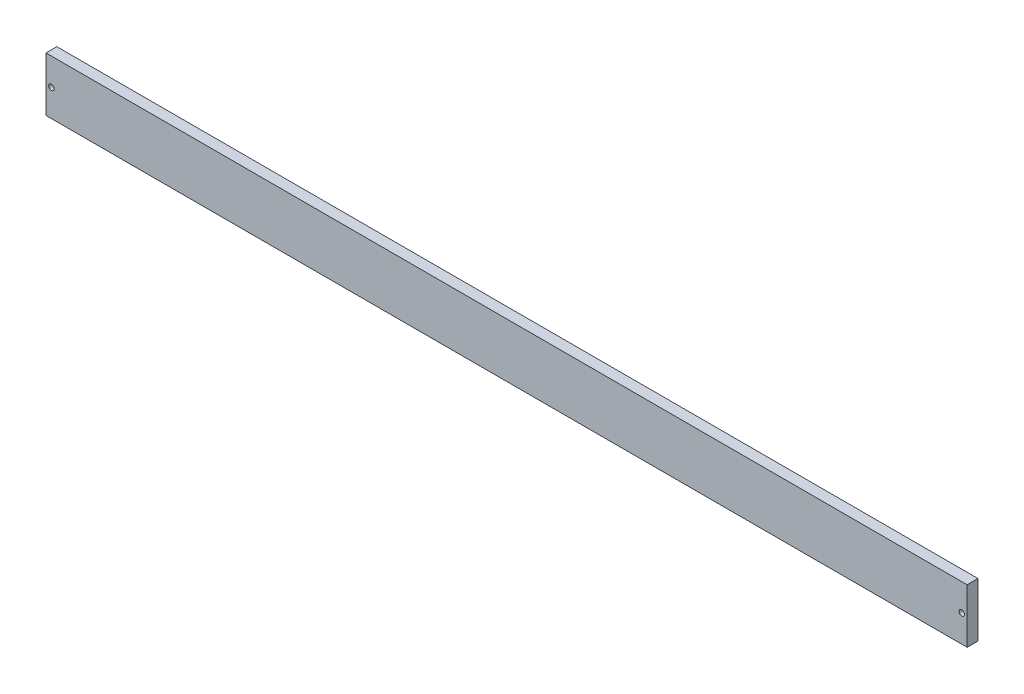
ISO-10303-21;
HEADER;
FILE_DESCRIPTION(('STEP AP214'),'2;1');
FILE_NAME('part.step','',(''),(''),'','','');
FILE_SCHEMA(('AUTOMOTIVE_DESIGN { 1 0 10303 214 1 1 1 1 }'));
ENDSEC;
DATA;
#1=APPLICATION_CONTEXT('core data for automotive mechanical design processes');
#2=APPLICATION_PROTOCOL_DEFINITION('international standard','automotive_design',2000,#1);
#3=PRODUCT_CONTEXT('',#1,'mechanical');
#4=PRODUCT('Part','Part','',(#3));
#5=PRODUCT_RELATED_PRODUCT_CATEGORY('part','',(#4));
#6=PRODUCT_DEFINITION_FORMATION('','',#4);
#7=PRODUCT_DEFINITION_CONTEXT('part definition',#1,'design');
#8=PRODUCT_DEFINITION('design','',#6,#7);
#9=PRODUCT_DEFINITION_SHAPE('','',#8);
#10=(LENGTH_UNIT() NAMED_UNIT(*) SI_UNIT(.MILLI.,.METRE.));
#11=(NAMED_UNIT(*) PLANE_ANGLE_UNIT() SI_UNIT($,.RADIAN.));
#12=(NAMED_UNIT(*) SI_UNIT($,.STERADIAN.) SOLID_ANGLE_UNIT());
#13=UNCERTAINTY_MEASURE_WITH_UNIT(LENGTH_MEASURE(1.E-05),#10,'distance_accuracy_value','');
#14=(GEOMETRIC_REPRESENTATION_CONTEXT(3) GLOBAL_UNCERTAINTY_ASSIGNED_CONTEXT((#13)) GLOBAL_UNIT_ASSIGNED_CONTEXT((#10,
#11,#12)) REPRESENTATION_CONTEXT('',''));
#15=CARTESIAN_POINT('',(0.,0.,0.));
#16=DIRECTION('',(0.,0.,1.));
#17=DIRECTION('',(1.,0.,0.));
#18=AXIS2_PLACEMENT_3D('',#15,#16,#17);
#19=CARTESIAN_POINT('',(425.,-25.,5.));
#20=DIRECTION('',(-1.,0.,0.));
#21=DIRECTION('',(0.,0.,1.));
#22=AXIS2_PLACEMENT_3D('',#19,#20,#21);
#23=PLANE('',#22);
#24=DIRECTION('',(0.,1.,0.));
#25=VECTOR('',#24,1.);
#26=CARTESIAN_POINT('',(425.,-25.,-5.));
#27=LINE('',#26,#25);
#28=CARTESIAN_POINT('',(425.,-25.,-5.));
#29=VERTEX_POINT('',#28);
#30=CARTESIAN_POINT('',(425.,25.,-5.));
#31=VERTEX_POINT('',#30);
#32=EDGE_CURVE('E95',#29,#31,#27,.T.);
#33=ORIENTED_EDGE('',*,*,#32,.T.);
#34=DIRECTION('',(0.,0.,-1.));
#35=VECTOR('',#34,1.);
#36=CARTESIAN_POINT('',(425.,25.,5.));
#37=LINE('',#36,#35);
#38=CARTESIAN_POINT('',(425.,25.,5.));
#39=VERTEX_POINT('',#38);
#40=EDGE_CURVE('E11',#39,#31,#37,.T.);
#41=ORIENTED_EDGE('',*,*,#40,.F.);
#42=DIRECTION('',(0.,1.,0.));
#43=VECTOR('',#42,1.);
#44=CARTESIAN_POINT('',(425.,-25.,5.));
#45=LINE('',#44,#43);
#46=CARTESIAN_POINT('',(425.,-25.,5.));
#47=VERTEX_POINT('',#46);
#48=EDGE_CURVE('E83',#47,#39,#45,.T.);
#49=ORIENTED_EDGE('',*,*,#48,.F.);
#50=DIRECTION('',(0.,0.,-1.));
#51=VECTOR('',#50,1.);
#52=CARTESIAN_POINT('',(425.,-25.,5.));
#53=LINE('',#52,#51);
#54=EDGE_CURVE('E91',#47,#29,#53,.T.);
#55=ORIENTED_EDGE('',*,*,#54,.T.);
#56=EDGE_LOOP('',(#33,#41,#49,#55));
#57=FACE_BOUND('',#56,.T.);
#58=ADVANCED_FACE('F32',(#57),#23,.F.);
#59=CARTESIAN_POINT('',(-425.,25.,5.));
#60=DIRECTION('',(0.,-1.,0.));
#61=DIRECTION('',(0.,0.,-1.));
#62=AXIS2_PLACEMENT_3D('',#59,#60,#61);
#63=PLANE('',#62);
#64=DIRECTION('',(-1.,0.,0.));
#65=VECTOR('',#64,1.);
#66=CARTESIAN_POINT('',(-425.,25.,-5.));
#67=LINE('',#66,#65);
#68=CARTESIAN_POINT('',(-425.,25.,-5.));
#69=VERTEX_POINT('',#68);
#70=EDGE_CURVE('E87',#31,#69,#67,.T.);
#71=ORIENTED_EDGE('',*,*,#70,.T.);
#72=DIRECTION('',(0.,0.,-1.));
#73=VECTOR('',#72,1.);
#74=CARTESIAN_POINT('',(-425.,25.,5.));
#75=LINE('',#74,#73);
#76=CARTESIAN_POINT('',(-425.,25.,5.));
#77=VERTEX_POINT('',#76);
#78=EDGE_CURVE('E40',#77,#69,#75,.T.);
#79=ORIENTED_EDGE('',*,*,#78,.F.);
#80=DIRECTION('',(-1.,0.,0.));
#81=VECTOR('',#80,1.);
#82=CARTESIAN_POINT('',(-425.,25.,5.));
#83=LINE('',#82,#81);
#84=EDGE_CURVE('E78',#39,#77,#83,.T.);
#85=ORIENTED_EDGE('',*,*,#84,.F.);
#86=ORIENTED_EDGE('',*,*,#40,.T.);
#87=EDGE_LOOP('',(#71,#79,#85,#86));
#88=FACE_BOUND('',#87,.T.);
#89=ADVANCED_FACE('F86',(#88),#63,.F.);
#90=CARTESIAN_POINT('',(-425.,-25.,5.));
#91=DIRECTION('',(1.,0.,0.));
#92=DIRECTION('',(0.,0.,-1.));
#93=AXIS2_PLACEMENT_3D('',#90,#91,#92);
#94=PLANE('',#93);
#95=DIRECTION('',(0.,-1.,0.));
#96=VECTOR('',#95,1.);
#97=CARTESIAN_POINT('',(-425.,-25.,-5.));
#98=LINE('',#97,#96);
#99=CARTESIAN_POINT('',(-425.,-25.,-5.));
#100=VERTEX_POINT('',#99);
#101=EDGE_CURVE('E65',#69,#100,#98,.T.);
#102=ORIENTED_EDGE('',*,*,#101,.T.);
#103=DIRECTION('',(0.,0.,-1.));
#104=VECTOR('',#103,1.);
#105=CARTESIAN_POINT('',(-425.,-25.,5.));
#106=LINE('',#105,#104);
#107=CARTESIAN_POINT('',(-425.,-25.,5.));
#108=VERTEX_POINT('',#107);
#109=EDGE_CURVE('E88',#108,#100,#106,.T.);
#110=ORIENTED_EDGE('',*,*,#109,.F.);
#111=DIRECTION('',(0.,-1.,0.));
#112=VECTOR('',#111,1.);
#113=CARTESIAN_POINT('',(-425.,-25.,5.));
#114=LINE('',#113,#112);
#115=EDGE_CURVE('E81',#77,#108,#114,.T.);
#116=ORIENTED_EDGE('',*,*,#115,.F.);
#117=ORIENTED_EDGE('',*,*,#78,.T.);
#118=EDGE_LOOP('',(#102,#110,#116,#117));
#119=FACE_BOUND('',#118,.T.);
#120=ADVANCED_FACE('F89',(#119),#94,.F.);
#121=CARTESIAN_POINT('',(-425.,-25.,5.));
#122=DIRECTION('',(0.,1.,0.));
#123=DIRECTION('',(0.,0.,1.));
#124=AXIS2_PLACEMENT_3D('',#121,#122,#123);
#125=PLANE('',#124);
#126=CARTESIAN_POINT('',(325.,-25.,0.));
#127=DIRECTION('',(0.,-1.,0.));
#128=DIRECTION('',(0.,0.,-1.));
#129=AXIS2_PLACEMENT_3D('',#126,#127,#128);
#130=CIRCLE('',#129,2.50000000000002);
#131=CARTESIAN_POINT('',(325.,-25.,-2.50000000000012));
#132=VERTEX_POINT('',#131);
#133=EDGE_CURVE('E151',#132,#132,#130,.T.);
#134=ORIENTED_EDGE('',*,*,#133,.F.);
#135=EDGE_LOOP('',(#134));
#136=FACE_BOUND('',#135,.T.);
#137=CARTESIAN_POINT('',(225.,-25.,0.));
#138=DIRECTION('',(0.,-1.,0.));
#139=DIRECTION('',(0.,0.,-1.));
#140=AXIS2_PLACEMENT_3D('',#137,#138,#139);
#141=CIRCLE('',#140,2.50000000000002);
#142=CARTESIAN_POINT('',(225.,-25.,-2.50000000000012));
#143=VERTEX_POINT('',#142);
#144=EDGE_CURVE('E145',#143,#143,#141,.T.);
#145=ORIENTED_EDGE('',*,*,#144,.F.);
#146=EDGE_LOOP('',(#145));
#147=FACE_BOUND('',#146,.T.);
#148=CARTESIAN_POINT('',(125.,-25.,0.));
#149=DIRECTION('',(0.,-1.,0.));
#150=DIRECTION('',(0.,0.,-1.));
#151=AXIS2_PLACEMENT_3D('',#148,#149,#150);
#152=CIRCLE('',#151,2.50000000000002);
#153=CARTESIAN_POINT('',(125.,-25.,-2.50000000000012));
#154=VERTEX_POINT('',#153);
#155=EDGE_CURVE('E139',#154,#154,#152,.T.);
#156=ORIENTED_EDGE('',*,*,#155,.F.);
#157=EDGE_LOOP('',(#156));
#158=FACE_BOUND('',#157,.T.);
#159=CARTESIAN_POINT('',(25.,-25.,0.));
#160=DIRECTION('',(0.,-1.,0.));
#161=DIRECTION('',(0.,0.,-1.));
#162=AXIS2_PLACEMENT_3D('',#159,#160,#161);
#163=CIRCLE('',#162,2.50000000000002);
#164=CARTESIAN_POINT('',(25.,-25.,-2.50000000000012));
#165=VERTEX_POINT('',#164);
#166=EDGE_CURVE('E133',#165,#165,#163,.T.);
#167=ORIENTED_EDGE('',*,*,#166,.F.);
#168=EDGE_LOOP('',(#167));
#169=FACE_BOUND('',#168,.T.);
#170=CARTESIAN_POINT('',(-75.,-25.,0.));
#171=DIRECTION('',(0.,-1.,0.));
#172=DIRECTION('',(0.,0.,-1.));
#173=AXIS2_PLACEMENT_3D('',#170,#171,#172);
#174=CIRCLE('',#173,2.50000000000002);
#175=CARTESIAN_POINT('',(-75.,-25.,-2.50000000000012));
#176=VERTEX_POINT('',#175);
#177=EDGE_CURVE('E127',#176,#176,#174,.T.);
#178=ORIENTED_EDGE('',*,*,#177,.F.);
#179=EDGE_LOOP('',(#178));
#180=FACE_BOUND('',#179,.T.);
#181=CARTESIAN_POINT('',(-175.,-25.,0.));
#182=DIRECTION('',(0.,-1.,0.));
#183=DIRECTION('',(0.,0.,-1.));
#184=AXIS2_PLACEMENT_3D('',#181,#182,#183);
#185=CIRCLE('',#184,2.50000000000002);
#186=CARTESIAN_POINT('',(-175.,-25.,-2.50000000000012));
#187=VERTEX_POINT('',#186);
#188=EDGE_CURVE('E121',#187,#187,#185,.T.);
#189=ORIENTED_EDGE('',*,*,#188,.F.);
#190=EDGE_LOOP('',(#189));
#191=FACE_BOUND('',#190,.T.);
#192=CARTESIAN_POINT('',(-275.,-25.,0.));
#193=DIRECTION('',(0.,-1.,0.));
#194=DIRECTION('',(0.,0.,-1.));
#195=AXIS2_PLACEMENT_3D('',#192,#193,#194);
#196=CIRCLE('',#195,2.50000000000002);
#197=CARTESIAN_POINT('',(-275.,-25.,-2.50000000000012));
#198=VERTEX_POINT('',#197);
#199=EDGE_CURVE('E115',#198,#198,#196,.T.);
#200=ORIENTED_EDGE('',*,*,#199,.F.);
#201=EDGE_LOOP('',(#200));
#202=FACE_BOUND('',#201,.T.);
#203=CARTESIAN_POINT('',(-375.,-25.,0.));
#204=DIRECTION('',(0.,-1.,0.));
#205=DIRECTION('',(0.,0.,-1.));
#206=AXIS2_PLACEMENT_3D('',#203,#204,#205);
#207=CIRCLE('',#206,2.50000000000002);
#208=CARTESIAN_POINT('',(-375.,-25.,-2.50000000000012));
#209=VERTEX_POINT('',#208);
#210=EDGE_CURVE('E109',#209,#209,#207,.T.);
#211=ORIENTED_EDGE('',*,*,#210,.F.);
#212=EDGE_LOOP('',(#211));
#213=FACE_BOUND('',#212,.T.);
#214=DIRECTION('',(1.,0.,0.));
#215=VECTOR('',#214,1.);
#216=CARTESIAN_POINT('',(-425.,-25.,-5.));
#217=LINE('',#216,#215);
#218=EDGE_CURVE('E71',#100,#29,#217,.T.);
#219=ORIENTED_EDGE('',*,*,#218,.T.);
#220=ORIENTED_EDGE('',*,*,#54,.F.);
#221=DIRECTION('',(1.,0.,0.));
#222=VECTOR('',#221,1.);
#223=CARTESIAN_POINT('',(-425.,-25.,5.));
#224=LINE('',#223,#222);
#225=EDGE_CURVE('E48',#108,#47,#224,.T.);
#226=ORIENTED_EDGE('',*,*,#225,.F.);
#227=ORIENTED_EDGE('',*,*,#109,.T.);
#228=EDGE_LOOP('',(#219,#220,#226,#227));
#229=FACE_BOUND('',#228,.T.);
#230=ADVANCED_FACE('F103',(#136,#147,#158,#169,#180,#191,#202,#213,#229),#125,.F.);
#231=CARTESIAN_POINT('',(0.,0.,5.));
#232=DIRECTION('',(0.,0.,-1.));
#233=DIRECTION('',(-1.,0.,0.));
#234=AXIS2_PLACEMENT_3D('',#231,#232,#233);
#235=PLANE('',#234);
#236=CARTESIAN_POINT('',(-420.,0.,5.));
#237=DIRECTION('',(0.,0.,-1.));
#238=DIRECTION('',(1.,0.,0.));
#239=AXIS2_PLACEMENT_3D('',#236,#237,#238);
#240=CIRCLE('',#239,2.50000000000002);
#241=CARTESIAN_POINT('',(-417.5,0.,5.));
#242=VERTEX_POINT('',#241);
#243=EDGE_CURVE('E160',#242,#242,#240,.T.);
#244=ORIENTED_EDGE('',*,*,#243,.T.);
#245=EDGE_LOOP('',(#244));
#246=FACE_BOUND('',#245,.T.);
#247=CARTESIAN_POINT('',(420.,0.,5.));
#248=DIRECTION('',(0.,0.,-1.));
#249=DIRECTION('',(-1.,0.,0.));
#250=AXIS2_PLACEMENT_3D('',#247,#248,#249);
#251=CIRCLE('',#250,2.50000000000002);
#252=CARTESIAN_POINT('',(417.5,0.,5.));
#253=VERTEX_POINT('',#252);
#254=EDGE_CURVE('E154',#253,#253,#251,.T.);
#255=ORIENTED_EDGE('',*,*,#254,.T.);
#256=EDGE_LOOP('',(#255));
#257=FACE_BOUND('',#256,.T.);
#258=ORIENTED_EDGE('',*,*,#48,.T.);
#259=ORIENTED_EDGE('',*,*,#84,.T.);
#260=ORIENTED_EDGE('',*,*,#115,.T.);
#261=ORIENTED_EDGE('',*,*,#225,.T.);
#262=EDGE_LOOP('',(#258,#259,#260,#261));
#263=FACE_BOUND('',#262,.T.);
#264=ADVANCED_FACE('F79',(#246,#257,#263),#235,.F.);
#265=CARTESIAN_POINT('',(0.,0.,-5.));
#266=DIRECTION('',(0.,0.,-1.));
#267=DIRECTION('',(-1.,0.,0.));
#268=AXIS2_PLACEMENT_3D('',#265,#266,#267);
#269=PLANE('',#268);
#270=ORIENTED_EDGE('',*,*,#32,.F.);
#271=ORIENTED_EDGE('',*,*,#218,.F.);
#272=ORIENTED_EDGE('',*,*,#101,.F.);
#273=ORIENTED_EDGE('',*,*,#70,.F.);
#274=EDGE_LOOP('',(#270,#271,#272,#273));
#275=FACE_BOUND('',#274,.T.);
#276=ADVANCED_FACE('F106',(#275),#269,.T.);
#277=CARTESIAN_POINT('',(-375.,-20.,0.));
#278=DIRECTION('',(0.,-1.,0.));
#279=DIRECTION('',(0.,0.,-1.));
#280=AXIS2_PLACEMENT_3D('',#277,#278,#279);
#281=CYLINDRICAL_SURFACE('',#280,2.50000000000002);
#282=CARTESIAN_POINT('',(-375.,-20.,0.));
#283=DIRECTION('',(0.,-1.,0.));
#284=DIRECTION('',(0.,0.,-1.));
#285=AXIS2_PLACEMENT_3D('',#282,#283,#284);
#286=CIRCLE('',#285,2.50000000000002);
#287=CARTESIAN_POINT('',(-375.,-20.,-2.50000000000012));
#288=VERTEX_POINT('',#287);
#289=EDGE_CURVE('E98',#288,#288,#286,.T.);
#290=ORIENTED_EDGE('',*,*,#289,.F.);
#291=EDGE_LOOP('',(#290));
#292=FACE_BOUND('',#291,.T.);
#293=ORIENTED_EDGE('',*,*,#210,.T.);
#294=EDGE_LOOP('',(#293));
#295=FACE_BOUND('',#294,.T.);
#296=ADVANCED_FACE('F197',(#292,#295),#281,.F.);
#297=CARTESIAN_POINT('',(-375.,-20.,0.));
#298=DIRECTION('',(0.,-1.,0.));
#299=DIRECTION('',(0.,0.,-1.));
#300=AXIS2_PLACEMENT_3D('',#297,#298,#299);
#301=PLANE('',#300);
#302=ORIENTED_EDGE('',*,*,#289,.T.);
#303=EDGE_LOOP('',(#302));
#304=FACE_BOUND('',#303,.T.);
#305=ADVANCED_FACE('F202',(#304),#301,.T.);
#306=CARTESIAN_POINT('',(-275.,-20.,0.));
#307=DIRECTION('',(0.,-1.,0.));
#308=DIRECTION('',(0.,0.,-1.));
#309=AXIS2_PLACEMENT_3D('',#306,#307,#308);
#310=CYLINDRICAL_SURFACE('',#309,2.50000000000002);
#311=CARTESIAN_POINT('',(-275.,-20.,0.));
#312=DIRECTION('',(0.,-1.,0.));
#313=DIRECTION('',(0.,0.,-1.));
#314=AXIS2_PLACEMENT_3D('',#311,#312,#313);
#315=CIRCLE('',#314,2.50000000000002);
#316=CARTESIAN_POINT('',(-275.,-20.,-2.50000000000012));
#317=VERTEX_POINT('',#316);
#318=EDGE_CURVE('E112',#317,#317,#315,.T.);
#319=ORIENTED_EDGE('',*,*,#318,.F.);
#320=EDGE_LOOP('',(#319));
#321=FACE_BOUND('',#320,.T.);
#322=ORIENTED_EDGE('',*,*,#199,.T.);
#323=EDGE_LOOP('',(#322));
#324=FACE_BOUND('',#323,.T.);
#325=ADVANCED_FACE('F206',(#321,#324),#310,.F.);
#326=CARTESIAN_POINT('',(-275.,-20.,0.));
#327=DIRECTION('',(0.,-1.,0.));
#328=DIRECTION('',(0.,0.,-1.));
#329=AXIS2_PLACEMENT_3D('',#326,#327,#328);
#330=PLANE('',#329);
#331=ORIENTED_EDGE('',*,*,#318,.T.);
#332=EDGE_LOOP('',(#331));
#333=FACE_BOUND('',#332,.T.);
#334=ADVANCED_FACE('F210',(#333),#330,.T.);
#335=CARTESIAN_POINT('',(-175.,-20.,0.));
#336=DIRECTION('',(0.,-1.,0.));
#337=DIRECTION('',(0.,0.,-1.));
#338=AXIS2_PLACEMENT_3D('',#335,#336,#337);
#339=CYLINDRICAL_SURFACE('',#338,2.50000000000002);
#340=CARTESIAN_POINT('',(-175.,-20.,0.));
#341=DIRECTION('',(0.,-1.,0.));
#342=DIRECTION('',(0.,0.,-1.));
#343=AXIS2_PLACEMENT_3D('',#340,#341,#342);
#344=CIRCLE('',#343,2.50000000000002);
#345=CARTESIAN_POINT('',(-175.,-20.,-2.50000000000012));
#346=VERTEX_POINT('',#345);
#347=EDGE_CURVE('E118',#346,#346,#344,.T.);
#348=ORIENTED_EDGE('',*,*,#347,.F.);
#349=EDGE_LOOP('',(#348));
#350=FACE_BOUND('',#349,.T.);
#351=ORIENTED_EDGE('',*,*,#188,.T.);
#352=EDGE_LOOP('',(#351));
#353=FACE_BOUND('',#352,.T.);
#354=ADVANCED_FACE('F214',(#350,#353),#339,.F.);
#355=CARTESIAN_POINT('',(-175.,-20.,0.));
#356=DIRECTION('',(0.,-1.,0.));
#357=DIRECTION('',(0.,0.,-1.));
#358=AXIS2_PLACEMENT_3D('',#355,#356,#357);
#359=PLANE('',#358);
#360=ORIENTED_EDGE('',*,*,#347,.T.);
#361=EDGE_LOOP('',(#360));
#362=FACE_BOUND('',#361,.T.);
#363=ADVANCED_FACE('F218',(#362),#359,.T.);
#364=CARTESIAN_POINT('',(-75.,-20.,0.));
#365=DIRECTION('',(0.,-1.,0.));
#366=DIRECTION('',(0.,0.,-1.));
#367=AXIS2_PLACEMENT_3D('',#364,#365,#366);
#368=CYLINDRICAL_SURFACE('',#367,2.50000000000002);
#369=CARTESIAN_POINT('',(-75.,-20.,0.));
#370=DIRECTION('',(0.,-1.,0.));
#371=DIRECTION('',(0.,0.,-1.));
#372=AXIS2_PLACEMENT_3D('',#369,#370,#371);
#373=CIRCLE('',#372,2.50000000000002);
#374=CARTESIAN_POINT('',(-75.,-20.,-2.50000000000012));
#375=VERTEX_POINT('',#374);
#376=EDGE_CURVE('E124',#375,#375,#373,.T.);
#377=ORIENTED_EDGE('',*,*,#376,.F.);
#378=EDGE_LOOP('',(#377));
#379=FACE_BOUND('',#378,.T.);
#380=ORIENTED_EDGE('',*,*,#177,.T.);
#381=EDGE_LOOP('',(#380));
#382=FACE_BOUND('',#381,.T.);
#383=ADVANCED_FACE('F222',(#379,#382),#368,.F.);
#384=CARTESIAN_POINT('',(-75.,-20.,0.));
#385=DIRECTION('',(0.,-1.,0.));
#386=DIRECTION('',(0.,0.,-1.));
#387=AXIS2_PLACEMENT_3D('',#384,#385,#386);
#388=PLANE('',#387);
#389=ORIENTED_EDGE('',*,*,#376,.T.);
#390=EDGE_LOOP('',(#389));
#391=FACE_BOUND('',#390,.T.);
#392=ADVANCED_FACE('F226',(#391),#388,.T.);
#393=CARTESIAN_POINT('',(25.,-20.,0.));
#394=DIRECTION('',(0.,-1.,0.));
#395=DIRECTION('',(0.,0.,-1.));
#396=AXIS2_PLACEMENT_3D('',#393,#394,#395);
#397=CYLINDRICAL_SURFACE('',#396,2.50000000000002);
#398=CARTESIAN_POINT('',(25.,-20.,0.));
#399=DIRECTION('',(0.,-1.,0.));
#400=DIRECTION('',(0.,0.,-1.));
#401=AXIS2_PLACEMENT_3D('',#398,#399,#400);
#402=CIRCLE('',#401,2.50000000000002);
#403=CARTESIAN_POINT('',(25.,-20.,-2.50000000000012));
#404=VERTEX_POINT('',#403);
#405=EDGE_CURVE('E130',#404,#404,#402,.T.);
#406=ORIENTED_EDGE('',*,*,#405,.F.);
#407=EDGE_LOOP('',(#406));
#408=FACE_BOUND('',#407,.T.);
#409=ORIENTED_EDGE('',*,*,#166,.T.);
#410=EDGE_LOOP('',(#409));
#411=FACE_BOUND('',#410,.T.);
#412=ADVANCED_FACE('F230',(#408,#411),#397,.F.);
#413=CARTESIAN_POINT('',(25.,-20.,0.));
#414=DIRECTION('',(0.,-1.,0.));
#415=DIRECTION('',(0.,0.,-1.));
#416=AXIS2_PLACEMENT_3D('',#413,#414,#415);
#417=PLANE('',#416);
#418=ORIENTED_EDGE('',*,*,#405,.T.);
#419=EDGE_LOOP('',(#418));
#420=FACE_BOUND('',#419,.T.);
#421=ADVANCED_FACE('F234',(#420),#417,.T.);
#422=CARTESIAN_POINT('',(125.,-20.,0.));
#423=DIRECTION('',(0.,-1.,0.));
#424=DIRECTION('',(0.,0.,-1.));
#425=AXIS2_PLACEMENT_3D('',#422,#423,#424);
#426=CYLINDRICAL_SURFACE('',#425,2.50000000000002);
#427=CARTESIAN_POINT('',(125.,-20.,0.));
#428=DIRECTION('',(0.,-1.,0.));
#429=DIRECTION('',(0.,0.,-1.));
#430=AXIS2_PLACEMENT_3D('',#427,#428,#429);
#431=CIRCLE('',#430,2.50000000000002);
#432=CARTESIAN_POINT('',(125.,-20.,-2.50000000000012));
#433=VERTEX_POINT('',#432);
#434=EDGE_CURVE('E136',#433,#433,#431,.T.);
#435=ORIENTED_EDGE('',*,*,#434,.F.);
#436=EDGE_LOOP('',(#435));
#437=FACE_BOUND('',#436,.T.);
#438=ORIENTED_EDGE('',*,*,#155,.T.);
#439=EDGE_LOOP('',(#438));
#440=FACE_BOUND('',#439,.T.);
#441=ADVANCED_FACE('F238',(#437,#440),#426,.F.);
#442=CARTESIAN_POINT('',(125.,-20.,0.));
#443=DIRECTION('',(0.,-1.,0.));
#444=DIRECTION('',(0.,0.,-1.));
#445=AXIS2_PLACEMENT_3D('',#442,#443,#444);
#446=PLANE('',#445);
#447=ORIENTED_EDGE('',*,*,#434,.T.);
#448=EDGE_LOOP('',(#447));
#449=FACE_BOUND('',#448,.T.);
#450=ADVANCED_FACE('F242',(#449),#446,.T.);
#451=CARTESIAN_POINT('',(225.,-20.,0.));
#452=DIRECTION('',(0.,-1.,0.));
#453=DIRECTION('',(0.,0.,-1.));
#454=AXIS2_PLACEMENT_3D('',#451,#452,#453);
#455=CYLINDRICAL_SURFACE('',#454,2.50000000000002);
#456=CARTESIAN_POINT('',(225.,-20.,0.));
#457=DIRECTION('',(0.,-1.,0.));
#458=DIRECTION('',(0.,0.,-1.));
#459=AXIS2_PLACEMENT_3D('',#456,#457,#458);
#460=CIRCLE('',#459,2.50000000000002);
#461=CARTESIAN_POINT('',(225.,-20.,-2.50000000000012));
#462=VERTEX_POINT('',#461);
#463=EDGE_CURVE('E142',#462,#462,#460,.T.);
#464=ORIENTED_EDGE('',*,*,#463,.F.);
#465=EDGE_LOOP('',(#464));
#466=FACE_BOUND('',#465,.T.);
#467=ORIENTED_EDGE('',*,*,#144,.T.);
#468=EDGE_LOOP('',(#467));
#469=FACE_BOUND('',#468,.T.);
#470=ADVANCED_FACE('F246',(#466,#469),#455,.F.);
#471=CARTESIAN_POINT('',(225.,-20.,0.));
#472=DIRECTION('',(0.,-1.,0.));
#473=DIRECTION('',(0.,0.,-1.));
#474=AXIS2_PLACEMENT_3D('',#471,#472,#473);
#475=PLANE('',#474);
#476=ORIENTED_EDGE('',*,*,#463,.T.);
#477=EDGE_LOOP('',(#476));
#478=FACE_BOUND('',#477,.T.);
#479=ADVANCED_FACE('F250',(#478),#475,.T.);
#480=CARTESIAN_POINT('',(325.,-20.,0.));
#481=DIRECTION('',(0.,-1.,0.));
#482=DIRECTION('',(0.,0.,-1.));
#483=AXIS2_PLACEMENT_3D('',#480,#481,#482);
#484=CYLINDRICAL_SURFACE('',#483,2.50000000000002);
#485=CARTESIAN_POINT('',(325.,-20.,0.));
#486=DIRECTION('',(0.,-1.,0.));
#487=DIRECTION('',(0.,0.,-1.));
#488=AXIS2_PLACEMENT_3D('',#485,#486,#487);
#489=CIRCLE('',#488,2.50000000000002);
#490=CARTESIAN_POINT('',(325.,-20.,-2.50000000000012));
#491=VERTEX_POINT('',#490);
#492=EDGE_CURVE('E148',#491,#491,#489,.T.);
#493=ORIENTED_EDGE('',*,*,#492,.F.);
#494=EDGE_LOOP('',(#493));
#495=FACE_BOUND('',#494,.T.);
#496=ORIENTED_EDGE('',*,*,#133,.T.);
#497=EDGE_LOOP('',(#496));
#498=FACE_BOUND('',#497,.T.);
#499=ADVANCED_FACE('F254',(#495,#498),#484,.F.);
#500=CARTESIAN_POINT('',(325.,-20.,0.));
#501=DIRECTION('',(0.,-1.,0.));
#502=DIRECTION('',(0.,0.,-1.));
#503=AXIS2_PLACEMENT_3D('',#500,#501,#502);
#504=PLANE('',#503);
#505=ORIENTED_EDGE('',*,*,#492,.T.);
#506=EDGE_LOOP('',(#505));
#507=FACE_BOUND('',#506,.T.);
#508=ADVANCED_FACE('F258',(#507),#504,.T.);
#509=CARTESIAN_POINT('',(420.,0.,5.));
#510=DIRECTION('',(0.,0.,-1.));
#511=DIRECTION('',(-1.,0.,0.));
#512=AXIS2_PLACEMENT_3D('',#509,#510,#511);
#513=CYLINDRICAL_SURFACE('',#512,2.50000000000002);
#514=ORIENTED_EDGE('',*,*,#254,.F.);
#515=EDGE_LOOP('',(#514));
#516=FACE_BOUND('',#515,.T.);
#517=CARTESIAN_POINT('',(420.,0.,0.));
#518=DIRECTION('',(0.,0.,-1.));
#519=DIRECTION('',(-1.,0.,0.));
#520=AXIS2_PLACEMENT_3D('',#517,#518,#519);
#521=CIRCLE('',#520,2.50000000000002);
#522=CARTESIAN_POINT('',(417.5,0.,0.));
#523=VERTEX_POINT('',#522);
#524=EDGE_CURVE('E157',#523,#523,#521,.T.);
#525=ORIENTED_EDGE('',*,*,#524,.T.);
#526=EDGE_LOOP('',(#525));
#527=FACE_BOUND('',#526,.T.);
#528=ADVANCED_FACE('F262',(#516,#527),#513,.F.);
#529=CARTESIAN_POINT('',(420.,0.,0.));
#530=DIRECTION('',(0.,0.,-1.));
#531=DIRECTION('',(-1.,0.,0.));
#532=AXIS2_PLACEMENT_3D('',#529,#530,#531);
#533=PLANE('',#532);
#534=ORIENTED_EDGE('',*,*,#524,.F.);
#535=EDGE_LOOP('',(#534));
#536=FACE_BOUND('',#535,.T.);
#537=ADVANCED_FACE('F175',(#536),#533,.F.);
#538=CARTESIAN_POINT('',(-420.,0.,5.));
#539=DIRECTION('',(0.,0.,-1.));
#540=DIRECTION('',(-1.,0.,0.));
#541=AXIS2_PLACEMENT_3D('',#538,#539,#540);
#542=CYLINDRICAL_SURFACE('',#541,2.50000000000002);
#543=ORIENTED_EDGE('',*,*,#243,.F.);
#544=EDGE_LOOP('',(#543));
#545=FACE_BOUND('',#544,.T.);
#546=CARTESIAN_POINT('',(-420.,0.,0.));
#547=DIRECTION('',(0.,0.,-1.));
#548=DIRECTION('',(1.,0.,0.));
#549=AXIS2_PLACEMENT_3D('',#546,#547,#548);
#550=CIRCLE('',#549,2.50000000000002);
#551=CARTESIAN_POINT('',(-417.5,0.,0.));
#552=VERTEX_POINT('',#551);
#553=EDGE_CURVE('E163',#552,#552,#550,.T.);
#554=ORIENTED_EDGE('',*,*,#553,.T.);
#555=EDGE_LOOP('',(#554));
#556=FACE_BOUND('',#555,.T.);
#557=ADVANCED_FACE('F171',(#545,#556),#542,.F.);
#558=CARTESIAN_POINT('',(-420.,0.,0.));
#559=DIRECTION('',(0.,0.,1.));
#560=DIRECTION('',(1.,0.,0.));
#561=AXIS2_PLACEMENT_3D('',#558,#559,#560);
#562=PLANE('',#561);
#563=ORIENTED_EDGE('',*,*,#553,.F.);
#564=EDGE_LOOP('',(#563));
#565=FACE_BOUND('',#564,.T.);
#566=ADVANCED_FACE('F174',(#565),#562,.T.);
#567=CLOSED_SHELL('',(#58,#89,#120,#230,#264,#276,#296,#305,#325,#334,#354,#363,#383,#392,#412,
#421,#441,#450,#470,#479,#499,#508,#528,#537,#557,#566));
#568=MANIFOLD_SOLID_BREP('B2',#567);
#569=ADVANCED_BREP_SHAPE_REPRESENTATION('',(#18,#568),#14);
#570=SHAPE_DEFINITION_REPRESENTATION(#9,#569);
ENDSEC;
END-ISO-10303-21;
